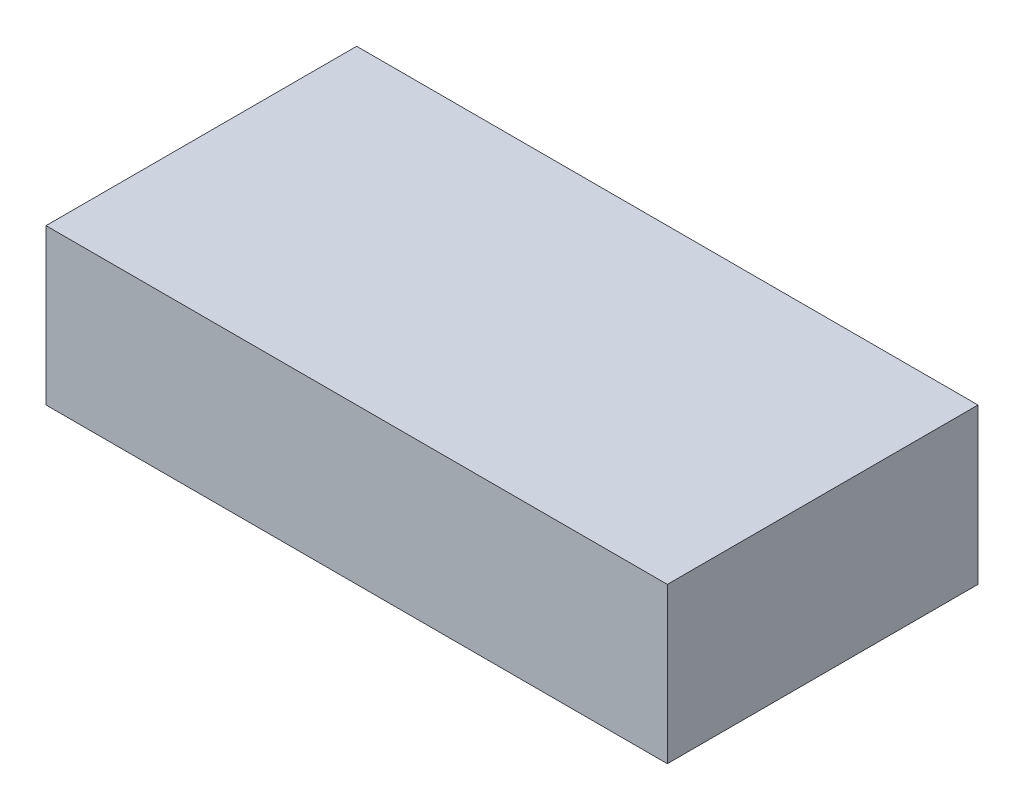
ISO-10303-21;
HEADER;
FILE_DESCRIPTION(('STEP AP214'),'2;1');
FILE_NAME('part.step','',(''),(''),'','','');
FILE_SCHEMA(('AUTOMOTIVE_DESIGN { 1 0 10303 214 1 1 1 1 }'));
ENDSEC;
DATA;
#1=APPLICATION_CONTEXT('core data for automotive mechanical design processes');
#2=APPLICATION_PROTOCOL_DEFINITION('international standard','automotive_design',2000,#1);
#3=PRODUCT_CONTEXT('',#1,'mechanical');
#4=PRODUCT('Part','Part','',(#3));
#5=PRODUCT_RELATED_PRODUCT_CATEGORY('part','',(#4));
#6=PRODUCT_DEFINITION_FORMATION('','',#4);
#7=PRODUCT_DEFINITION_CONTEXT('part definition',#1,'design');
#8=PRODUCT_DEFINITION('design','',#6,#7);
#9=PRODUCT_DEFINITION_SHAPE('','',#8);
#10=(LENGTH_UNIT() NAMED_UNIT(*) SI_UNIT(.MILLI.,.METRE.));
#11=(NAMED_UNIT(*) PLANE_ANGLE_UNIT() SI_UNIT($,.RADIAN.));
#12=(NAMED_UNIT(*) SI_UNIT($,.STERADIAN.) SOLID_ANGLE_UNIT());
#13=UNCERTAINTY_MEASURE_WITH_UNIT(LENGTH_MEASURE(1.E-05),#10,'distance_accuracy_value','');
#14=(GEOMETRIC_REPRESENTATION_CONTEXT(3) GLOBAL_UNCERTAINTY_ASSIGNED_CONTEXT((#13)) GLOBAL_UNIT_ASSIGNED_CONTEXT((#10,
#11,#12)) REPRESENTATION_CONTEXT('',''));
#15=CARTESIAN_POINT('',(0.,0.,0.));
#16=DIRECTION('',(0.,0.,1.));
#17=DIRECTION('',(1.,0.,0.));
#18=AXIS2_PLACEMENT_3D('',#15,#16,#17);
#19=CARTESIAN_POINT('',(0.,10.,-20.));
#20=DIRECTION('',(1.,0.,0.));
#21=DIRECTION('',(0.,0.,-1.));
#22=AXIS2_PLACEMENT_3D('',#19,#20,#21);
#23=PLANE('',#22);
#24=DIRECTION('',(0.,0.,1.));
#25=VECTOR('',#24,1.);
#26=CARTESIAN_POINT('',(0.,0.,-20.));
#27=LINE('',#26,#25);
#28=CARTESIAN_POINT('',(0.,0.,-20.));
#29=VERTEX_POINT('',#28);
#30=CARTESIAN_POINT('',(0.,0.,0.));
#31=VERTEX_POINT('',#30);
#32=EDGE_CURVE('E104',#29,#31,#27,.T.);
#33=ORIENTED_EDGE('',*,*,#32,.T.);
#34=DIRECTION('',(0.,-1.,0.));
#35=VECTOR('',#34,1.);
#36=CARTESIAN_POINT('',(0.,10.,0.));
#37=LINE('',#36,#35);
#38=CARTESIAN_POINT('',(0.,10.,0.));
#39=VERTEX_POINT('',#38);
#40=EDGE_CURVE('E11',#39,#31,#37,.T.);
#41=ORIENTED_EDGE('',*,*,#40,.F.);
#42=DIRECTION('',(0.,0.,1.));
#43=VECTOR('',#42,1.);
#44=CARTESIAN_POINT('',(0.,10.,-20.));
#45=LINE('',#44,#43);
#46=CARTESIAN_POINT('',(0.,10.,-20.));
#47=VERTEX_POINT('',#46);
#48=EDGE_CURVE('E92',#47,#39,#45,.T.);
#49=ORIENTED_EDGE('',*,*,#48,.F.);
#50=DIRECTION('',(0.,-1.,0.));
#51=VECTOR('',#50,1.);
#52=CARTESIAN_POINT('',(0.,10.,-20.));
#53=LINE('',#52,#51);
#54=EDGE_CURVE('E100',#47,#29,#53,.T.);
#55=ORIENTED_EDGE('',*,*,#54,.T.);
#56=EDGE_LOOP('',(#33,#41,#49,#55));
#57=FACE_BOUND('',#56,.T.);
#58=ADVANCED_FACE('F41',(#57),#23,.F.);
#59=CARTESIAN_POINT('',(0.,10.,0.));
#60=DIRECTION('',(0.,0.,-1.));
#61=DIRECTION('',(-1.,0.,0.));
#62=AXIS2_PLACEMENT_3D('',#59,#60,#61);
#63=PLANE('',#62);
#64=DIRECTION('',(1.,0.,0.));
#65=VECTOR('',#64,1.);
#66=CARTESIAN_POINT('',(0.,0.,0.));
#67=LINE('',#66,#65);
#68=CARTESIAN_POINT('',(40.,0.,0.));
#69=VERTEX_POINT('',#68);
#70=EDGE_CURVE('E96',#31,#69,#67,.T.);
#71=ORIENTED_EDGE('',*,*,#70,.T.);
#72=DIRECTION('',(0.,-1.,0.));
#73=VECTOR('',#72,1.);
#74=CARTESIAN_POINT('',(40.,10.,0.));
#75=LINE('',#74,#73);
#76=CARTESIAN_POINT('',(40.,10.,0.));
#77=VERTEX_POINT('',#76);
#78=EDGE_CURVE('E49',#77,#69,#75,.T.);
#79=ORIENTED_EDGE('',*,*,#78,.F.);
#80=DIRECTION('',(1.,0.,0.));
#81=VECTOR('',#80,1.);
#82=CARTESIAN_POINT('',(0.,10.,0.));
#83=LINE('',#82,#81);
#84=EDGE_CURVE('E87',#39,#77,#83,.T.);
#85=ORIENTED_EDGE('',*,*,#84,.F.);
#86=ORIENTED_EDGE('',*,*,#40,.T.);
#87=EDGE_LOOP('',(#71,#79,#85,#86));
#88=FACE_BOUND('',#87,.T.);
#89=ADVANCED_FACE('F95',(#88),#63,.F.);
#90=CARTESIAN_POINT('',(40.,10.,0.));
#91=DIRECTION('',(-1.,0.,0.));
#92=DIRECTION('',(0.,0.,1.));
#93=AXIS2_PLACEMENT_3D('',#90,#91,#92);
#94=PLANE('',#93);
#95=DIRECTION('',(0.,0.,-1.));
#96=VECTOR('',#95,1.);
#97=CARTESIAN_POINT('',(40.,0.,0.));
#98=LINE('',#97,#96);
#99=CARTESIAN_POINT('',(40.,0.,-20.));
#100=VERTEX_POINT('',#99);
#101=EDGE_CURVE('E74',#69,#100,#98,.T.);
#102=ORIENTED_EDGE('',*,*,#101,.T.);
#103=DIRECTION('',(0.,-1.,0.));
#104=VECTOR('',#103,1.);
#105=CARTESIAN_POINT('',(40.,10.,-20.));
#106=LINE('',#105,#104);
#107=CARTESIAN_POINT('',(40.,10.,-20.));
#108=VERTEX_POINT('',#107);
#109=EDGE_CURVE('E97',#108,#100,#106,.T.);
#110=ORIENTED_EDGE('',*,*,#109,.F.);
#111=DIRECTION('',(0.,0.,-1.));
#112=VECTOR('',#111,1.);
#113=CARTESIAN_POINT('',(40.,10.,0.));
#114=LINE('',#113,#112);
#115=EDGE_CURVE('E90',#77,#108,#114,.T.);
#116=ORIENTED_EDGE('',*,*,#115,.F.);
#117=ORIENTED_EDGE('',*,*,#78,.T.);
#118=EDGE_LOOP('',(#102,#110,#116,#117));
#119=FACE_BOUND('',#118,.T.);
#120=ADVANCED_FACE('F98',(#119),#94,.F.);
#121=CARTESIAN_POINT('',(40.,10.,-20.));
#122=DIRECTION('',(0.,0.,1.));
#123=DIRECTION('',(1.,0.,0.));
#124=AXIS2_PLACEMENT_3D('',#121,#122,#123);
#125=PLANE('',#124);
#126=DIRECTION('',(-1.,0.,0.));
#127=VECTOR('',#126,1.);
#128=CARTESIAN_POINT('',(40.,0.,-20.));
#129=LINE('',#128,#127);
#130=EDGE_CURVE('E80',#100,#29,#129,.T.);
#131=ORIENTED_EDGE('',*,*,#130,.T.);
#132=ORIENTED_EDGE('',*,*,#54,.F.);
#133=DIRECTION('',(-1.,0.,0.));
#134=VECTOR('',#133,1.);
#135=CARTESIAN_POINT('',(40.,10.,-20.));
#136=LINE('',#135,#134);
#137=EDGE_CURVE('E57',#108,#47,#136,.T.);
#138=ORIENTED_EDGE('',*,*,#137,.F.);
#139=ORIENTED_EDGE('',*,*,#109,.T.);
#140=EDGE_LOOP('',(#131,#132,#138,#139));
#141=FACE_BOUND('',#140,.T.);
#142=ADVANCED_FACE('F111',(#141),#125,.F.);
#143=CARTESIAN_POINT('',(0.,10.,0.));
#144=DIRECTION('',(0.,1.,0.));
#145=DIRECTION('',(0.,0.,1.));
#146=AXIS2_PLACEMENT_3D('',#143,#144,#145);
#147=PLANE('',#146);
#148=ORIENTED_EDGE('',*,*,#48,.T.);
#149=ORIENTED_EDGE('',*,*,#84,.T.);
#150=ORIENTED_EDGE('',*,*,#115,.T.);
#151=ORIENTED_EDGE('',*,*,#137,.T.);
#152=EDGE_LOOP('',(#148,#149,#150,#151));
#153=FACE_BOUND('',#152,.T.);
#154=ADVANCED_FACE('F88',(#153),#147,.T.);
#155=CARTESIAN_POINT('',(0.,0.,0.));
#156=DIRECTION('',(0.,1.,0.));
#157=DIRECTION('',(0.,0.,1.));
#158=AXIS2_PLACEMENT_3D('',#155,#156,#157);
#159=PLANE('',#158);
#160=ORIENTED_EDGE('',*,*,#32,.F.);
#161=ORIENTED_EDGE('',*,*,#130,.F.);
#162=ORIENTED_EDGE('',*,*,#101,.F.);
#163=ORIENTED_EDGE('',*,*,#70,.F.);
#164=EDGE_LOOP('',(#160,#161,#162,#163));
#165=FACE_BOUND('',#164,.T.);
#166=ADVANCED_FACE('F114',(#165),#159,.F.);
#167=CLOSED_SHELL('',(#58,#89,#120,#142,#154,#166));
#168=MANIFOLD_SOLID_BREP('B2',#167);
#169=ADVANCED_BREP_SHAPE_REPRESENTATION('',(#18,#168),#14);
#170=SHAPE_DEFINITION_REPRESENTATION(#9,#169);
ENDSEC;
END-ISO-10303-21;
